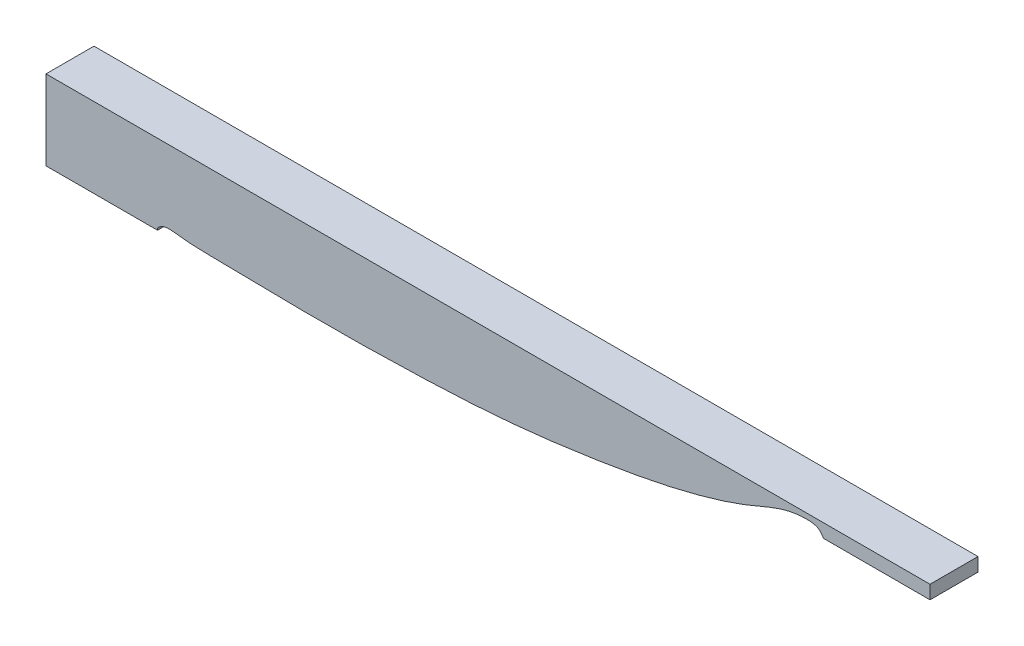
ISO-10303-21;
HEADER;
FILE_DESCRIPTION(('STEP AP214'),'2;1');
FILE_NAME('part.step','',(''),(''),'','','');
FILE_SCHEMA(('AUTOMOTIVE_DESIGN { 1 0 10303 214 1 1 1 1 }'));
ENDSEC;
DATA;
#1=APPLICATION_CONTEXT('core data for automotive mechanical design processes');
#2=APPLICATION_PROTOCOL_DEFINITION('international standard','automotive_design',2000,#1);
#3=PRODUCT_CONTEXT('',#1,'mechanical');
#4=PRODUCT('Part','Part','',(#3));
#5=PRODUCT_RELATED_PRODUCT_CATEGORY('part','',(#4));
#6=PRODUCT_DEFINITION_FORMATION('','',#4);
#7=PRODUCT_DEFINITION_CONTEXT('part definition',#1,'design');
#8=PRODUCT_DEFINITION('design','',#6,#7);
#9=PRODUCT_DEFINITION_SHAPE('','',#8);
#10=(LENGTH_UNIT() NAMED_UNIT(*) SI_UNIT(.MILLI.,.METRE.));
#11=(NAMED_UNIT(*) PLANE_ANGLE_UNIT() SI_UNIT($,.RADIAN.));
#12=(NAMED_UNIT(*) SI_UNIT($,.STERADIAN.) SOLID_ANGLE_UNIT());
#13=UNCERTAINTY_MEASURE_WITH_UNIT(LENGTH_MEASURE(1.E-05),#10,'distance_accuracy_value','');
#14=(GEOMETRIC_REPRESENTATION_CONTEXT(3) GLOBAL_UNCERTAINTY_ASSIGNED_CONTEXT((#13)) GLOBAL_UNIT_ASSIGNED_CONTEXT((#10,
#11,#12)) REPRESENTATION_CONTEXT('',''));
#15=CARTESIAN_POINT('',(0.,0.,0.));
#16=DIRECTION('',(0.,0.,1.));
#17=DIRECTION('',(1.,0.,0.));
#18=AXIS2_PLACEMENT_3D('',#15,#16,#17);
#19=CARTESIAN_POINT('',(-83.0436002358615,-11.0301957148444,460.));
#20=DIRECTION('',(1.,2.45463803547062E-13,0.));
#21=DIRECTION('',(-2.45463803547062E-13,1.,0.));
#22=AXIS2_PLACEMENT_3D('',#19,#20,#21);
#23=PLANE('',#22);
#24=DIRECTION('',(2.45463803547062E-13,-1.,0.));
#25=VECTOR('',#24,1.);
#26=CARTESIAN_POINT('',(-83.0436002358615,-11.0301957148444,452.));
#27=LINE('',#26,#25);
#28=CARTESIAN_POINT('',(-83.0436002358648,2.25600000000003,452.));
#29=VERTEX_POINT('',#28);
#30=CARTESIAN_POINT('',(-83.0436002358615,-11.0301957148444,452.));
#31=VERTEX_POINT('',#30);
#32=EDGE_CURVE('E121',#29,#31,#27,.T.);
#33=ORIENTED_EDGE('',*,*,#32,.T.);
#34=DIRECTION('',(0.,0.,-1.));
#35=VECTOR('',#34,1.);
#36=CARTESIAN_POINT('',(-83.0436002358615,-11.0301957148444,460.));
#37=LINE('',#36,#35);
#38=CARTESIAN_POINT('',(-83.0436002358615,-11.0301957148444,460.));
#39=VERTEX_POINT('',#38);
#40=EDGE_CURVE('E11',#39,#31,#37,.T.);
#41=ORIENTED_EDGE('',*,*,#40,.F.);
#42=DIRECTION('',(2.45463803547062E-13,-1.,0.));
#43=VECTOR('',#42,1.);
#44=CARTESIAN_POINT('',(-83.0436002358615,-11.0301957148444,460.));
#45=LINE('',#44,#43);
#46=CARTESIAN_POINT('',(-83.0436002358648,2.25600000000003,460.));
#47=VERTEX_POINT('',#46);
#48=EDGE_CURVE('E127',#47,#39,#45,.T.);
#49=ORIENTED_EDGE('',*,*,#48,.F.);
#50=DIRECTION('',(0.,0.,-1.));
#51=VECTOR('',#50,1.);
#52=CARTESIAN_POINT('',(-83.0436002358648,2.25600000000003,460.));
#53=LINE('',#52,#51);
#54=EDGE_CURVE('E113',#47,#29,#53,.T.);
#55=ORIENTED_EDGE('',*,*,#54,.T.);
#56=EDGE_LOOP('',(#33,#41,#49,#55));
#57=FACE_BOUND('',#56,.T.);
#58=ADVANCED_FACE('F30',(#57),#23,.F.);
#59=CARTESIAN_POINT('',(-83.0436002358615,-11.0301957148444,460.));
#60=DIRECTION('',(-1.20431191335873E-07,0.999999999999993,0.));
#61=DIRECTION('',(-0.999999999999993,-1.20431191335873E-07,0.));
#62=AXIS2_PLACEMENT_3D('',#59,#60,#61);
#63=PLANE('',#62);
#64=DIRECTION('',(0.999999999999993,1.20431191335873E-07,0.));
#65=VECTOR('',#64,1.);
#66=CARTESIAN_POINT('',(-83.0436002358615,-11.0301957148444,452.));
#67=LINE('',#66,#65);
#68=CARTESIAN_POINT('',(-64.4521820690451,-11.0301934758578,452.));
#69=VERTEX_POINT('',#68);
#70=EDGE_CURVE('E124',#31,#69,#67,.T.);
#71=ORIENTED_EDGE('',*,*,#70,.T.);
#72=DIRECTION('',(0.,0.,-1.));
#73=VECTOR('',#72,1.);
#74=CARTESIAN_POINT('',(-64.4521820690451,-11.0301934758578,460.));
#75=LINE('',#74,#73);
#76=CARTESIAN_POINT('',(-64.4521820690451,-11.0301934758578,460.));
#77=VERTEX_POINT('',#76);
#78=EDGE_CURVE('E39',#77,#69,#75,.T.);
#79=ORIENTED_EDGE('',*,*,#78,.F.);
#80=DIRECTION('',(0.999999999999993,1.20431191335873E-07,0.));
#81=VECTOR('',#80,1.);
#82=CARTESIAN_POINT('',(-83.0436002358615,-11.0301957148444,460.));
#83=LINE('',#82,#81);
#84=EDGE_CURVE('E85',#39,#77,#83,.T.);
#85=ORIENTED_EDGE('',*,*,#84,.F.);
#86=ORIENTED_EDGE('',*,*,#40,.T.);
#87=EDGE_LOOP('',(#71,#79,#85,#86));
#88=FACE_BOUND('',#87,.T.);
#89=ADVANCED_FACE('F180',(#88),#63,.F.);
#90=CARTESIAN_POINT('',(-64.4521820690451,-11.0301934758578,460.));
#91=CARTESIAN_POINT('',(-64.4583225614616,-10.9558043293569,460.));
#92=CARTESIAN_POINT('',(-64.463387652067,-10.8812802806346,460.));
#93=CARTESIAN_POINT('',(-64.4434066613252,-10.7335212167107,460.));
#94=CARTESIAN_POINT('',(-64.4182782084376,-10.661349845285,460.));
#95=CARTESIAN_POINT('',(-64.3379515304761,-10.5344278081653,460.));
#96=CARTESIAN_POINT('',(-64.2819372520297,-10.4835279145921,460.));
#97=CARTESIAN_POINT('',(-64.1597559021687,-10.397546637622,460.));
#98=CARTESIAN_POINT('',(-64.0960085709245,-10.3587051965568,460.));
#99=CARTESIAN_POINT('',(-63.906184468823,-10.239966393352,460.));
#100=CARTESIAN_POINT('',(-63.7758890040075,-10.165967001731,460.));
#101=CARTESIAN_POINT('',(-63.5069592785328,-10.0386454678959,460.));
#102=CARTESIAN_POINT('',(-63.3657543738775,-9.98691803376802,460.));
#103=CARTESIAN_POINT('',(-62.9316554788115,-9.88112495281915,460.));
#104=CARTESIAN_POINT('',(-62.6382088905062,-9.86847219139759,460.));
#105=CARTESIAN_POINT('',(-62.04844175906,-9.88426366368219,460.));
#106=CARTESIAN_POINT('',(-61.7527351629519,-9.91256660486391,460.));
#107=CARTESIAN_POINT('',(-61.1651068592972,-9.98249549461026,460.));
#108=CARTESIAN_POINT('',(-60.8720954542825,-10.0246922083138,460.));
#109=CARTESIAN_POINT('',(-60.2846602472937,-10.0963607835702,460.));
#110=CARTESIAN_POINT('',(-59.9904158784852,-10.1274747449811,460.));
#111=CARTESIAN_POINT('',(-59.1060696836713,-10.2061301540092,460.));
#112=CARTESIAN_POINT('',(-58.5158550587583,-10.2381690347571,460.));
#113=CARTESIAN_POINT('',(-57.3347759707603,-10.2818693354637,460.));
#114=CARTESIAN_POINT('',(-56.7439379356378,-10.2943594767727,460.));
#115=CARTESIAN_POINT('',(-55.562256887244,-10.3191836558625,460.));
#116=CARTESIAN_POINT('',(-54.9714325779592,-10.3321042085133,460.));
#117=CARTESIAN_POINT('',(-53.198848157185,-10.3673696997329,460.));
#118=CARTESIAN_POINT('',(-52.0169819276523,-10.38649983606,460.));
#119=CARTESIAN_POINT('',(-48.4714397961875,-10.4431764880181,460.));
#120=CARTESIAN_POINT('',(-46.1076740215182,-10.4768630521989,460.));
#121=CARTESIAN_POINT('',(-41.3799914017273,-10.5309140303929,460.));
#122=CARTESIAN_POINT('',(-39.0160589049298,-10.5486770838621,460.));
#123=CARTESIAN_POINT('',(-34.2881262258983,-10.5472181551001,460.));
#124=CARTESIAN_POINT('',(-31.9241842126814,-10.5281648984433,460.));
#125=CARTESIAN_POINT('',(-27.1974065205092,-10.4490155559805,460.));
#126=CARTESIAN_POINT('',(-24.8344110512482,-10.3901812532554,460.));
#127=CARTESIAN_POINT('',(-20.1090464428182,-10.2418476823174,460.));
#128=CARTESIAN_POINT('',(-17.7466964956738,-10.1523843056438,460.));
#129=CARTESIAN_POINT('',(-13.025169500107,-9.92514625216393,460.));
#130=CARTESIAN_POINT('',(-10.6658913894852,-9.78565301024608,460.));
#131=CARTESIAN_POINT('',(-5.9521516131187,-9.42276804232382,460.));
#132=CARTESIAN_POINT('',(-3.59790557557596,-9.19906166727227,460.));
#133=CARTESIAN_POINT('',(1.09871750322525,-8.66888750534282,460.));
#134=CARTESIAN_POINT('',(3.44221281032166,-8.36431717400982,460.));
#135=CARTESIAN_POINT('',(8.12198783962608,-7.69602347911736,460.));
#136=CARTESIAN_POINT('',(10.4582005132575,-7.33141530104771,460.));
#137=CARTESIAN_POINT('',(15.1174766693951,-6.52925414941208,460.));
#138=CARTESIAN_POINT('',(17.441624168963,-6.09408993264674,460.));
#139=CARTESIAN_POINT('',(20.9095615641131,-5.35639745345167,460.));
#140=CARTESIAN_POINT('',(22.063097127063,-5.09549432231687,460.));
#141=CARTESIAN_POINT('',(24.3589556822209,-4.53655475289295,460.));
#142=CARTESIAN_POINT('',(25.5008617393003,-4.23818454757673,460.));
#143=CARTESIAN_POINT('',(27.7726108931919,-3.60359145949388,460.));
#144=CARTESIAN_POINT('',(28.9026555320304,-3.26800100070486,460.));
#145=CARTESIAN_POINT('',(31.1466658119167,-2.54636537685138,460.));
#146=CARTESIAN_POINT('',(32.2604665890432,-2.15980288099079,460.));
#147=CARTESIAN_POINT('',(33.9136025345485,-1.52484077493587,460.));
#148=CARTESIAN_POINT('',(34.461806092912,-1.30426951683409,460.));
#149=CARTESIAN_POINT('',(35.5550417881106,-0.853175314351541,460.));
#150=CARTESIAN_POINT('',(36.0995848022135,-0.621102725934356,460.));
#151=CARTESIAN_POINT('',(37.7359367704677,0.0664715112131328,460.));
#152=CARTESIAN_POINT('',(38.8314513839325,0.510123253082578,460.));
#153=CARTESIAN_POINT('',(40.5340856727456,0.986046376172816,460.));
#154=CARTESIAN_POINT('',(41.1118823217161,1.11195134095011,460.));
#155=CARTESIAN_POINT('',(42.2887132217696,1.29594586951799,460.));
#156=CARTESIAN_POINT('',(42.8863216657517,1.35505017610386,460.));
#157=CARTESIAN_POINT('',(43.7783702928729,1.37830180745775,460.));
#158=CARTESIAN_POINT('',(44.0758166948426,1.37553649899916,460.));
#159=CARTESIAN_POINT('',(44.5222949948661,1.337873914124,460.));
#160=CARTESIAN_POINT('',(44.6711704206906,1.31996451408882,460.));
#161=CARTESIAN_POINT('',(44.9690439102179,1.2708311653159,460.));
#162=CARTESIAN_POINT('',(45.1159715777668,1.23936278596125,460.));
#163=CARTESIAN_POINT('',(45.4026020755093,1.15197786545058,460.));
#164=CARTESIAN_POINT('',(45.5444318646208,1.09438490611884,460.));
#165=CARTESIAN_POINT('',(45.8026846466545,0.940210610022735,460.));
#166=CARTESIAN_POINT('',(45.9159497093206,0.841779520725542,460.));
#167=CARTESIAN_POINT('',(46.1242766714465,0.62180644291824,460.));
#168=CARTESIAN_POINT('',(46.2164488899286,0.502075803920924,460.));
#169=CARTESIAN_POINT('',(46.3604007994969,0.327106450089588,460.));
#170=CARTESIAN_POINT('',(46.4086207456441,0.268975086482211,460.));
#171=CARTESIAN_POINT('',(46.4938537361615,0.143605630771252,460.));
#172=CARTESIAN_POINT('',(46.528419939708,0.0755447118457188,460.));
#173=CARTESIAN_POINT('',(46.5411825552873,1.57609114561502E-13,460.));
#174=B_SPLINE_CURVE_WITH_KNOTS('',3,(#90,#91,#92,#93,#94,#95,#96,#97,#98,#99,#100,#101,#102,
#103,#104,#105,#106,#107,#108,#109,#110,#111,#112,#113,#114,#115,#116,#117,#118,#119,#120,#121,
#122,#123,#124,#125,#126,#127,#128,#129,#130,#131,#132,#133,#134,#135,#136,#137,#138,#139,#140,
#141,#142,#143,#144,#145,#146,#147,#148,#149,#150,#151,#152,#153,#154,#155,#156,#157,#158,#159,
#160,#161,#162,#163,#164,#165,#166,#167,#168,#169,#170,#171,#172,#173),.UNSPECIFIED.,.F.,.F.,(4,
2,2,2,2,2,2,2,2,2,2,2,2,2,2,2,2,2,2,2,2,2,2,2,2,2,2,2,2,2,2,2,2,2,2,2,2,2,2,2,2,4),(0.,
0.001953125,0.00390625,0.00585937499999989,0.00781249999999989,0.01171875,0.015625,
0.0234375000000002,0.0312500000000001,0.0390625000000002,0.0468750000000002,0.0625000000000002,
0.0781250000000002,0.0937500000000001,0.125,0.1875,0.25,0.3125,0.375,0.4375,0.5,
0.562500000000001,0.625000000000001,0.687500000000001,0.750000000000001,0.781250000000001,
0.812500000000001,0.843750000000001,0.875000000000001,0.890625,0.90625,0.9375,0.953125,0.96875,
0.976562499999999,0.98046875,0.984375,0.98828125,0.9921875,0.99609375,0.998046875,1.),.UNSPECIFIED.);
#175=DIRECTION('',(0.,0.,-1.));
#176=VECTOR('',#175,1.);
#177=SURFACE_OF_LINEAR_EXTRUSION('',#174,#176);
#178=CARTESIAN_POINT('',(-64.4521820690451,-11.0301934758578,452.));
#179=CARTESIAN_POINT('',(-64.4583225614616,-10.9558043293569,452.));
#180=CARTESIAN_POINT('',(-64.463387652067,-10.8812802806346,452.));
#181=CARTESIAN_POINT('',(-64.4434066613252,-10.7335212167107,452.));
#182=CARTESIAN_POINT('',(-64.4182782084376,-10.661349845285,452.));
#183=CARTESIAN_POINT('',(-64.3379515304761,-10.5344278081653,452.));
#184=CARTESIAN_POINT('',(-64.2819372520297,-10.4835279145921,452.));
#185=CARTESIAN_POINT('',(-64.1597559021687,-10.397546637622,452.));
#186=CARTESIAN_POINT('',(-64.0960085709245,-10.3587051965568,452.));
#187=CARTESIAN_POINT('',(-63.906184468823,-10.239966393352,452.));
#188=CARTESIAN_POINT('',(-63.7758890040075,-10.165967001731,452.));
#189=CARTESIAN_POINT('',(-63.5069592785328,-10.0386454678959,452.));
#190=CARTESIAN_POINT('',(-63.3657543738775,-9.98691803376802,452.));
#191=CARTESIAN_POINT('',(-62.9316554788115,-9.88112495281915,452.));
#192=CARTESIAN_POINT('',(-62.6382088905062,-9.86847219139759,452.));
#193=CARTESIAN_POINT('',(-62.04844175906,-9.88426366368219,452.));
#194=CARTESIAN_POINT('',(-61.7527351629519,-9.91256660486391,452.));
#195=CARTESIAN_POINT('',(-61.1651068592972,-9.98249549461026,452.));
#196=CARTESIAN_POINT('',(-60.8720954542825,-10.0246922083138,452.));
#197=CARTESIAN_POINT('',(-60.2846602472937,-10.0963607835702,452.));
#198=CARTESIAN_POINT('',(-59.9904158784852,-10.1274747449811,452.));
#199=CARTESIAN_POINT('',(-59.1060696836713,-10.2061301540092,452.));
#200=CARTESIAN_POINT('',(-58.5158550587583,-10.2381690347571,452.));
#201=CARTESIAN_POINT('',(-57.3347759707603,-10.2818693354637,452.));
#202=CARTESIAN_POINT('',(-56.7439379356378,-10.2943594767727,452.));
#203=CARTESIAN_POINT('',(-55.562256887244,-10.3191836558625,452.));
#204=CARTESIAN_POINT('',(-54.9714325779592,-10.3321042085133,452.));
#205=CARTESIAN_POINT('',(-53.198848157185,-10.3673696997329,452.));
#206=CARTESIAN_POINT('',(-52.0169819276523,-10.38649983606,452.));
#207=CARTESIAN_POINT('',(-48.4714397961875,-10.4431764880181,452.));
#208=CARTESIAN_POINT('',(-46.1076740215182,-10.4768630521989,452.));
#209=CARTESIAN_POINT('',(-41.3799914017273,-10.5309140303929,452.));
#210=CARTESIAN_POINT('',(-39.0160589049298,-10.5486770838621,452.));
#211=CARTESIAN_POINT('',(-34.2881262258983,-10.5472181551001,452.));
#212=CARTESIAN_POINT('',(-31.9241842126814,-10.5281648984433,452.));
#213=CARTESIAN_POINT('',(-27.1974065205092,-10.4490155559805,452.));
#214=CARTESIAN_POINT('',(-24.8344110512482,-10.3901812532554,452.));
#215=CARTESIAN_POINT('',(-20.1090464428182,-10.2418476823174,452.));
#216=CARTESIAN_POINT('',(-17.7466964956738,-10.1523843056438,452.));
#217=CARTESIAN_POINT('',(-13.025169500107,-9.92514625216393,452.));
#218=CARTESIAN_POINT('',(-10.6658913894852,-9.78565301024608,452.));
#219=CARTESIAN_POINT('',(-5.9521516131187,-9.42276804232382,452.));
#220=CARTESIAN_POINT('',(-3.59790557557596,-9.19906166727227,452.));
#221=CARTESIAN_POINT('',(1.09871750322525,-8.66888750534282,452.));
#222=CARTESIAN_POINT('',(3.44221281032166,-8.36431717400982,452.));
#223=CARTESIAN_POINT('',(8.12198783962608,-7.69602347911736,452.));
#224=CARTESIAN_POINT('',(10.4582005132575,-7.33141530104771,452.));
#225=CARTESIAN_POINT('',(15.1174766693951,-6.52925414941208,452.));
#226=CARTESIAN_POINT('',(17.441624168963,-6.09408993264674,452.));
#227=CARTESIAN_POINT('',(20.9095615641131,-5.35639745345167,452.));
#228=CARTESIAN_POINT('',(22.063097127063,-5.09549432231687,452.));
#229=CARTESIAN_POINT('',(24.3589556822209,-4.53655475289295,452.));
#230=CARTESIAN_POINT('',(25.5008617393003,-4.23818454757673,452.));
#231=CARTESIAN_POINT('',(27.7726108931919,-3.60359145949388,452.));
#232=CARTESIAN_POINT('',(28.9026555320304,-3.26800100070486,452.));
#233=CARTESIAN_POINT('',(31.1466658119167,-2.54636537685138,452.));
#234=CARTESIAN_POINT('',(32.2604665890432,-2.15980288099079,452.));
#235=CARTESIAN_POINT('',(33.9136025345485,-1.52484077493587,452.));
#236=CARTESIAN_POINT('',(34.461806092912,-1.30426951683409,452.));
#237=CARTESIAN_POINT('',(35.5550417881106,-0.853175314351541,452.));
#238=CARTESIAN_POINT('',(36.0995848022135,-0.621102725934356,452.));
#239=CARTESIAN_POINT('',(37.7359367704677,0.0664715112131328,452.));
#240=CARTESIAN_POINT('',(38.8314513839325,0.510123253082578,452.));
#241=CARTESIAN_POINT('',(40.5340856727456,0.986046376172816,452.));
#242=CARTESIAN_POINT('',(41.1118823217161,1.11195134095011,452.));
#243=CARTESIAN_POINT('',(42.2887132217696,1.29594586951799,452.));
#244=CARTESIAN_POINT('',(42.8863216657517,1.35505017610386,452.));
#245=CARTESIAN_POINT('',(43.7783702928729,1.37830180745775,452.));
#246=CARTESIAN_POINT('',(44.0758166948426,1.37553649899916,452.));
#247=CARTESIAN_POINT('',(44.5222949948661,1.337873914124,452.));
#248=CARTESIAN_POINT('',(44.6711704206906,1.31996451408882,452.));
#249=CARTESIAN_POINT('',(44.9690439102179,1.2708311653159,452.));
#250=CARTESIAN_POINT('',(45.1159715777668,1.23936278596125,452.));
#251=CARTESIAN_POINT('',(45.4026020755093,1.15197786545058,452.));
#252=CARTESIAN_POINT('',(45.5444318646208,1.09438490611884,452.));
#253=CARTESIAN_POINT('',(45.8026846466545,0.940210610022735,452.));
#254=CARTESIAN_POINT('',(45.9159497093206,0.841779520725542,452.));
#255=CARTESIAN_POINT('',(46.1242766714465,0.62180644291824,452.));
#256=CARTESIAN_POINT('',(46.2164488899286,0.502075803920924,452.));
#257=CARTESIAN_POINT('',(46.3604007994969,0.327106450089588,452.));
#258=CARTESIAN_POINT('',(46.4086207456441,0.268975086482211,452.));
#259=CARTESIAN_POINT('',(46.4938537361615,0.143605630771252,452.));
#260=CARTESIAN_POINT('',(46.528419939708,0.0755447118457188,452.));
#261=CARTESIAN_POINT('',(46.5411825552873,1.57609114561502E-13,452.));
#262=B_SPLINE_CURVE_WITH_KNOTS('',3,(#178,#179,#180,#181,#182,#183,#184,#185,#186,#187,#188,
#189,#190,#191,#192,#193,#194,#195,#196,#197,#198,#199,#200,#201,#202,#203,#204,#205,#206,#207,
#208,#209,#210,#211,#212,#213,#214,#215,#216,#217,#218,#219,#220,#221,#222,#223,#224,#225,#226,
#227,#228,#229,#230,#231,#232,#233,#234,#235,#236,#237,#238,#239,#240,#241,#242,#243,#244,#245,
#246,#247,#248,#249,#250,#251,#252,#253,#254,#255,#256,#257,#258,#259,#260,#261),.UNSPECIFIED.,
.F.,.F.,(4,2,2,2,2,2,2,2,2,2,2,2,2,2,2,2,2,2,2,2,2,2,2,2,2,2,2,2,2,2,2,2,2,2,2,2,2,2,2,2,2,4),
(0.,0.001953125,0.00390625,0.00585937499999989,0.00781249999999989,0.01171875,0.015625,
0.0234375000000002,0.0312500000000001,0.0390625000000002,0.0468750000000002,0.0625000000000002,
0.0781250000000002,0.0937500000000001,0.125,0.1875,0.25,0.3125,0.375,0.4375,0.5,
0.562500000000001,0.625000000000001,0.687500000000001,0.750000000000001,0.781250000000001,
0.812500000000001,0.843750000000001,0.875000000000001,0.890625,0.90625,0.9375,0.953125,0.96875,
0.976562499999999,0.98046875,0.984375,0.98828125,0.9921875,0.99609375,0.998046875,1.),.UNSPECIFIED.);
#263=CARTESIAN_POINT('',(46.5411825552873,1.57609114561502E-13,452.));
#264=VERTEX_POINT('',#263);
#265=EDGE_CURVE('E163',#69,#264,#262,.T.);
#266=ORIENTED_EDGE('',*,*,#265,.T.);
#267=DIRECTION('',(0.,0.,-1.));
#268=VECTOR('',#267,1.);
#269=CARTESIAN_POINT('',(46.5411825552873,1.57609114561502E-13,460.));
#270=LINE('',#269,#268);
#271=CARTESIAN_POINT('',(46.5411825552873,1.57609114561502E-13,460.));
#272=VERTEX_POINT('',#271);
#273=EDGE_CURVE('E108',#272,#264,#270,.T.);
#274=ORIENTED_EDGE('',*,*,#273,.F.);
#275=CARTESIAN_POINT('',(46.5411825552873,1.57609114561502E-13,460.));
#276=CARTESIAN_POINT('',(46.528419939708,0.0755447118457188,460.));
#277=CARTESIAN_POINT('',(46.4938537361615,0.143605630771252,460.));
#278=CARTESIAN_POINT('',(46.4086207456441,0.268975086482211,460.));
#279=CARTESIAN_POINT('',(46.3604007994969,0.327106450089588,460.));
#280=CARTESIAN_POINT('',(46.2164488899286,0.502075803920924,460.));
#281=CARTESIAN_POINT('',(46.1242766714465,0.62180644291824,460.));
#282=CARTESIAN_POINT('',(45.9159497093206,0.841779520725542,460.));
#283=CARTESIAN_POINT('',(45.8026846466545,0.940210610022735,460.));
#284=CARTESIAN_POINT('',(45.5444318646208,1.09438490611884,460.));
#285=CARTESIAN_POINT('',(45.4026020755093,1.15197786545058,460.));
#286=CARTESIAN_POINT('',(45.1159715777668,1.23936278596125,460.));
#287=CARTESIAN_POINT('',(44.9690439102179,1.2708311653159,460.));
#288=CARTESIAN_POINT('',(44.6711704206906,1.31996451408882,460.));
#289=CARTESIAN_POINT('',(44.5222949948661,1.337873914124,460.));
#290=CARTESIAN_POINT('',(44.0758166948426,1.37553649899916,460.));
#291=CARTESIAN_POINT('',(43.7783702928729,1.37830180745775,460.));
#292=CARTESIAN_POINT('',(42.8863216657517,1.35505017610386,460.));
#293=CARTESIAN_POINT('',(42.2887132217696,1.29594586951799,460.));
#294=CARTESIAN_POINT('',(41.1118823217161,1.11195134095011,460.));
#295=CARTESIAN_POINT('',(40.5340856727456,0.986046376172816,460.));
#296=CARTESIAN_POINT('',(38.8314513839325,0.510123253082578,460.));
#297=CARTESIAN_POINT('',(37.7359367704677,0.0664715112131328,460.));
#298=CARTESIAN_POINT('',(36.0995848022135,-0.621102725934356,460.));
#299=CARTESIAN_POINT('',(35.5550417881106,-0.853175314351541,460.));
#300=CARTESIAN_POINT('',(34.461806092912,-1.30426951683409,460.));
#301=CARTESIAN_POINT('',(33.9136025345485,-1.52484077493587,460.));
#302=CARTESIAN_POINT('',(32.2604665890432,-2.15980288099079,460.));
#303=CARTESIAN_POINT('',(31.1466658119167,-2.54636537685138,460.));
#304=CARTESIAN_POINT('',(28.9026555320304,-3.26800100070486,460.));
#305=CARTESIAN_POINT('',(27.7726108931919,-3.60359145949388,460.));
#306=CARTESIAN_POINT('',(25.5008617393003,-4.23818454757673,460.));
#307=CARTESIAN_POINT('',(24.3589556822209,-4.53655475289295,460.));
#308=CARTESIAN_POINT('',(22.063097127063,-5.09549432231687,460.));
#309=CARTESIAN_POINT('',(20.9095615641131,-5.35639745345167,460.));
#310=CARTESIAN_POINT('',(17.441624168963,-6.09408993264674,460.));
#311=CARTESIAN_POINT('',(15.1174766693951,-6.52925414941208,460.));
#312=CARTESIAN_POINT('',(10.4582005132575,-7.33141530104771,460.));
#313=CARTESIAN_POINT('',(8.12198783962608,-7.69602347911736,460.));
#314=CARTESIAN_POINT('',(3.44221281032166,-8.36431717400982,460.));
#315=CARTESIAN_POINT('',(1.09871750322525,-8.66888750534282,460.));
#316=CARTESIAN_POINT('',(-3.59790557557596,-9.19906166727227,460.));
#317=CARTESIAN_POINT('',(-5.9521516131187,-9.42276804232382,460.));
#318=CARTESIAN_POINT('',(-10.6658913894852,-9.78565301024608,460.));
#319=CARTESIAN_POINT('',(-13.025169500107,-9.92514625216393,460.));
#320=CARTESIAN_POINT('',(-17.7466964956738,-10.1523843056438,460.));
#321=CARTESIAN_POINT('',(-20.1090464428182,-10.2418476823174,460.));
#322=CARTESIAN_POINT('',(-24.8344110512482,-10.3901812532554,460.));
#323=CARTESIAN_POINT('',(-27.1974065205092,-10.4490155559805,460.));
#324=CARTESIAN_POINT('',(-31.9241842126814,-10.5281648984433,460.));
#325=CARTESIAN_POINT('',(-34.2881262258983,-10.5472181551001,460.));
#326=CARTESIAN_POINT('',(-39.0160589049298,-10.5486770838621,460.));
#327=CARTESIAN_POINT('',(-41.3799914017273,-10.5309140303929,460.));
#328=CARTESIAN_POINT('',(-46.1076740215182,-10.4768630521989,460.));
#329=CARTESIAN_POINT('',(-48.4714397961875,-10.4431764880181,460.));
#330=CARTESIAN_POINT('',(-52.0169819276523,-10.38649983606,460.));
#331=CARTESIAN_POINT('',(-53.198848157185,-10.3673696997329,460.));
#332=CARTESIAN_POINT('',(-54.9714325779592,-10.3321042085133,460.));
#333=CARTESIAN_POINT('',(-55.562256887244,-10.3191836558625,460.));
#334=CARTESIAN_POINT('',(-56.7439379356378,-10.2943594767727,460.));
#335=CARTESIAN_POINT('',(-57.3347759707603,-10.2818693354637,460.));
#336=CARTESIAN_POINT('',(-58.5158550587583,-10.2381690347571,460.));
#337=CARTESIAN_POINT('',(-59.1060696836713,-10.2061301540092,460.));
#338=CARTESIAN_POINT('',(-59.9904158784852,-10.1274747449811,460.));
#339=CARTESIAN_POINT('',(-60.2846602472937,-10.0963607835702,460.));
#340=CARTESIAN_POINT('',(-60.8720954542825,-10.0246922083138,460.));
#341=CARTESIAN_POINT('',(-61.1651068592972,-9.98249549461026,460.));
#342=CARTESIAN_POINT('',(-61.7527351629519,-9.91256660486391,460.));
#343=CARTESIAN_POINT('',(-62.04844175906,-9.88426366368219,460.));
#344=CARTESIAN_POINT('',(-62.6382088905062,-9.86847219139759,460.));
#345=CARTESIAN_POINT('',(-62.9316554788115,-9.88112495281915,460.));
#346=CARTESIAN_POINT('',(-63.3657543738775,-9.98691803376802,460.));
#347=CARTESIAN_POINT('',(-63.5069592785328,-10.0386454678959,460.));
#348=CARTESIAN_POINT('',(-63.7758890040075,-10.165967001731,460.));
#349=CARTESIAN_POINT('',(-63.906184468823,-10.239966393352,460.));
#350=CARTESIAN_POINT('',(-64.0960085709245,-10.3587051965568,460.));
#351=CARTESIAN_POINT('',(-64.1597559021687,-10.397546637622,460.));
#352=CARTESIAN_POINT('',(-64.2819372520297,-10.4835279145921,460.));
#353=CARTESIAN_POINT('',(-64.3379515304761,-10.5344278081653,460.));
#354=CARTESIAN_POINT('',(-64.4182782084376,-10.661349845285,460.));
#355=CARTESIAN_POINT('',(-64.4434066613252,-10.7335212167107,460.));
#356=CARTESIAN_POINT('',(-64.463387652067,-10.8812802806346,460.));
#357=CARTESIAN_POINT('',(-64.4583225614616,-10.9558043293569,460.));
#358=CARTESIAN_POINT('',(-64.4521820690451,-11.0301934758578,460.));
#359=B_SPLINE_CURVE_WITH_KNOTS('',3,(#275,#276,#277,#278,#279,#280,#281,#282,#283,#284,#285,
#286,#287,#288,#289,#290,#291,#292,#293,#294,#295,#296,#297,#298,#299,#300,#301,#302,#303,#304,
#305,#306,#307,#308,#309,#310,#311,#312,#313,#314,#315,#316,#317,#318,#319,#320,#321,#322,#323,
#324,#325,#326,#327,#328,#329,#330,#331,#332,#333,#334,#335,#336,#337,#338,#339,#340,#341,#342,
#343,#344,#345,#346,#347,#348,#349,#350,#351,#352,#353,#354,#355,#356,#357,#358),.UNSPECIFIED.,
.F.,.F.,(4,2,2,2,2,2,2,2,2,2,2,2,2,2,2,2,2,2,2,2,2,2,2,2,2,2,2,2,2,2,2,2,2,2,2,2,2,2,2,2,2,4),
(0.,0.00195312500000011,0.00390625000000022,0.00781250000000022,0.0117187500000003,
0.0156250000000004,0.0195312500000004,0.0234375000000006,0.0312500000000004,0.0468750000000002,
0.0625,0.0937499999999996,0.109375,0.124999999999999,0.156249999999999,0.187499999999999,
0.218749999999999,0.249999999999999,0.312499999999999,0.374999999999999,0.437499999999999,0.5,
0.5625,0.625,0.6875,0.75,0.8125,0.875,0.90625,0.921875,0.9375,0.953125,0.9609375,0.96875,
0.9765625,0.984375,0.98828125,0.9921875,0.994140625,0.99609375,0.998046875,1.),.UNSPECIFIED.);
#360=EDGE_CURVE('E98',#77,#272,#359,.F.);
#361=ORIENTED_EDGE('',*,*,#360,.F.);
#362=ORIENTED_EDGE('',*,*,#78,.T.);
#363=EDGE_LOOP('',(#266,#274,#361,#362));
#364=FACE_BOUND('',#363,.T.);
#365=ADVANCED_FACE('F168',(#364),#177,.F.);
#366=CARTESIAN_POINT('',(46.5411825552865,0.,460.));
#367=DIRECTION('',(0.,1.,0.));
#368=DIRECTION('',(-1.,0.,0.));
#369=AXIS2_PLACEMENT_3D('',#366,#367,#368);
#370=PLANE('',#369);
#371=DIRECTION('',(1.,0.,0.));
#372=VECTOR('',#371,1.);
#373=CARTESIAN_POINT('',(46.5411825552865,0.,452.));
#374=LINE('',#373,#372);
#375=CARTESIAN_POINT('',(64.3279758412379,0.,452.));
#376=VERTEX_POINT('',#375);
#377=EDGE_CURVE('E107',#264,#376,#374,.T.);
#378=ORIENTED_EDGE('',*,*,#377,.T.);
#379=DIRECTION('',(0.,0.,-1.));
#380=VECTOR('',#379,1.);
#381=CARTESIAN_POINT('',(64.3279758412379,0.,460.));
#382=LINE('',#381,#380);
#383=CARTESIAN_POINT('',(64.3279758412379,0.,460.));
#384=VERTEX_POINT('',#383);
#385=EDGE_CURVE('E104',#384,#376,#382,.T.);
#386=ORIENTED_EDGE('',*,*,#385,.F.);
#387=DIRECTION('',(1.,0.,0.));
#388=VECTOR('',#387,1.);
#389=CARTESIAN_POINT('',(46.5411825552865,0.,460.));
#390=LINE('',#389,#388);
#391=EDGE_CURVE('E92',#272,#384,#390,.T.);
#392=ORIENTED_EDGE('',*,*,#391,.F.);
#393=ORIENTED_EDGE('',*,*,#273,.T.);
#394=EDGE_LOOP('',(#378,#386,#392,#393));
#395=FACE_BOUND('',#394,.T.);
#396=ADVANCED_FACE('F105',(#395),#370,.F.);
#397=CARTESIAN_POINT('',(64.3279758412379,2.25600000000005,460.));
#398=DIRECTION('',(-1.,0.,0.));
#399=DIRECTION('',(0.,0.,1.));
#400=AXIS2_PLACEMENT_3D('',#397,#398,#399);
#401=PLANE('',#400);
#402=DIRECTION('',(0.,1.,0.));
#403=VECTOR('',#402,1.);
#404=CARTESIAN_POINT('',(64.3279758412379,2.25600000000005,452.));
#405=LINE('',#404,#403);
#406=CARTESIAN_POINT('',(64.3279758412379,2.25600000000005,452.));
#407=VERTEX_POINT('',#406);
#408=EDGE_CURVE('E71',#376,#407,#405,.T.);
#409=ORIENTED_EDGE('',*,*,#408,.T.);
#410=DIRECTION('',(0.,0.,-1.));
#411=VECTOR('',#410,1.);
#412=CARTESIAN_POINT('',(64.3279758412379,2.25600000000005,460.));
#413=LINE('',#412,#411);
#414=CARTESIAN_POINT('',(64.3279758412379,2.25600000000005,460.));
#415=VERTEX_POINT('',#414);
#416=EDGE_CURVE('E109',#415,#407,#413,.T.);
#417=ORIENTED_EDGE('',*,*,#416,.F.);
#418=DIRECTION('',(0.,1.,0.));
#419=VECTOR('',#418,1.);
#420=CARTESIAN_POINT('',(64.3279758412379,2.25600000000005,460.));
#421=LINE('',#420,#419);
#422=EDGE_CURVE('E96',#384,#415,#421,.T.);
#423=ORIENTED_EDGE('',*,*,#422,.F.);
#424=ORIENTED_EDGE('',*,*,#385,.T.);
#425=EDGE_LOOP('',(#409,#417,#423,#424));
#426=FACE_BOUND('',#425,.T.);
#427=ADVANCED_FACE('F111',(#426),#401,.F.);
#428=CARTESIAN_POINT('',(64.3279758412379,2.25600000000005,460.));
#429=DIRECTION('',(0.,-1.,0.));
#430=DIRECTION('',(1.,0.,0.));
#431=AXIS2_PLACEMENT_3D('',#428,#429,#430);
#432=PLANE('',#431);
#433=DIRECTION('',(-1.,0.,0.));
#434=VECTOR('',#433,1.);
#435=CARTESIAN_POINT('',(64.3279758412379,2.25600000000005,452.));
#436=LINE('',#435,#434);
#437=EDGE_CURVE('E77',#407,#29,#436,.T.);
#438=ORIENTED_EDGE('',*,*,#437,.T.);
#439=ORIENTED_EDGE('',*,*,#54,.F.);
#440=DIRECTION('',(-1.,0.,0.));
#441=VECTOR('',#440,1.);
#442=CARTESIAN_POINT('',(64.3279758412379,2.25600000000005,460.));
#443=LINE('',#442,#441);
#444=EDGE_CURVE('E48',#415,#47,#443,.T.);
#445=ORIENTED_EDGE('',*,*,#444,.F.);
#446=ORIENTED_EDGE('',*,*,#416,.T.);
#447=EDGE_LOOP('',(#438,#439,#445,#446));
#448=FACE_BOUND('',#447,.T.);
#449=ADVANCED_FACE('F144',(#448),#432,.F.);
#450=CARTESIAN_POINT('',(-8.30902150130201,-9.60421052628496,460.));
#451=DIRECTION('',(0.,0.,-1.));
#452=DIRECTION('',(-1.,0.,0.));
#453=AXIS2_PLACEMENT_3D('',#450,#451,#452);
#454=PLANE('',#453);
#455=ORIENTED_EDGE('',*,*,#48,.T.);
#456=ORIENTED_EDGE('',*,*,#84,.T.);
#457=ORIENTED_EDGE('',*,*,#360,.T.);
#458=ORIENTED_EDGE('',*,*,#391,.T.);
#459=ORIENTED_EDGE('',*,*,#422,.T.);
#460=ORIENTED_EDGE('',*,*,#444,.T.);
#461=EDGE_LOOP('',(#455,#456,#457,#458,#459,#460));
#462=FACE_BOUND('',#461,.T.);
#463=ADVANCED_FACE('F94',(#462),#454,.F.);
#464=CARTESIAN_POINT('',(-8.30902150130201,-9.60421052628496,452.));
#465=DIRECTION('',(0.,0.,-1.));
#466=DIRECTION('',(-1.,0.,0.));
#467=AXIS2_PLACEMENT_3D('',#464,#465,#466);
#468=PLANE('',#467);
#469=ORIENTED_EDGE('',*,*,#32,.F.);
#470=ORIENTED_EDGE('',*,*,#437,.F.);
#471=ORIENTED_EDGE('',*,*,#408,.F.);
#472=ORIENTED_EDGE('',*,*,#377,.F.);
#473=ORIENTED_EDGE('',*,*,#265,.F.);
#474=ORIENTED_EDGE('',*,*,#70,.F.);
#475=EDGE_LOOP('',(#469,#470,#471,#472,#473,#474));
#476=FACE_BOUND('',#475,.T.);
#477=ADVANCED_FACE('F143',(#476),#468,.T.);
#478=CLOSED_SHELL('',(#58,#89,#365,#396,#427,#449,#463,#477));
#479=MANIFOLD_SOLID_BREP('B2',#478);
#480=ADVANCED_BREP_SHAPE_REPRESENTATION('',(#18,#479),#14);
#481=SHAPE_DEFINITION_REPRESENTATION(#9,#480);
ENDSEC;
END-ISO-10303-21;
